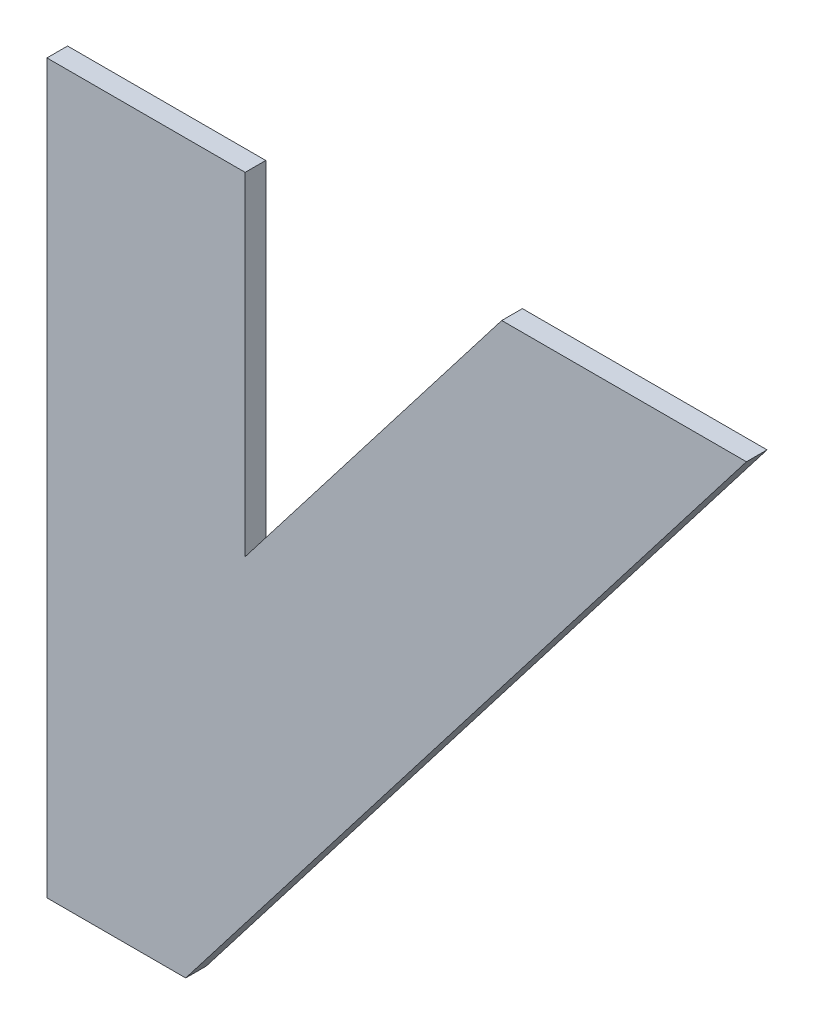
ISO-10303-21;
HEADER;
FILE_DESCRIPTION(('STEP AP214'),'2;1');
FILE_NAME('part.step','',(''),(''),'','','');
FILE_SCHEMA(('AUTOMOTIVE_DESIGN { 1 0 10303 214 1 1 1 1 }'));
ENDSEC;
DATA;
#1=APPLICATION_CONTEXT('core data for automotive mechanical design processes');
#2=APPLICATION_PROTOCOL_DEFINITION('international standard','automotive_design',2000,#1);
#3=PRODUCT_CONTEXT('',#1,'mechanical');
#4=PRODUCT('Part','Part','',(#3));
#5=PRODUCT_RELATED_PRODUCT_CATEGORY('part','',(#4));
#6=PRODUCT_DEFINITION_FORMATION('','',#4);
#7=PRODUCT_DEFINITION_CONTEXT('part definition',#1,'design');
#8=PRODUCT_DEFINITION('design','',#6,#7);
#9=PRODUCT_DEFINITION_SHAPE('','',#8);
#10=(LENGTH_UNIT() NAMED_UNIT(*) SI_UNIT(.MILLI.,.METRE.));
#11=(NAMED_UNIT(*) PLANE_ANGLE_UNIT() SI_UNIT($,.RADIAN.));
#12=(NAMED_UNIT(*) SI_UNIT($,.STERADIAN.) SOLID_ANGLE_UNIT());
#13=UNCERTAINTY_MEASURE_WITH_UNIT(LENGTH_MEASURE(1.E-05),#10,'distance_accuracy_value','');
#14=(GEOMETRIC_REPRESENTATION_CONTEXT(3) GLOBAL_UNCERTAINTY_ASSIGNED_CONTEXT((#13)) GLOBAL_UNIT_ASSIGNED_CONTEXT((#10,
#11,#12)) REPRESENTATION_CONTEXT('',''));
#15=CARTESIAN_POINT('',(0.,0.,0.));
#16=DIRECTION('',(0.,0.,1.));
#17=DIRECTION('',(1.,0.,0.));
#18=AXIS2_PLACEMENT_3D('',#15,#16,#17);
#19=CARTESIAN_POINT('',(-3.07692307692411,-14.6153846153846,0.6));
#20=DIRECTION('',(0.,1.,0.));
#21=DIRECTION('',(0.,0.,1.));
#22=AXIS2_PLACEMENT_3D('',#19,#20,#21);
#23=PLANE('',#22);
#24=DIRECTION('',(-1.,0.,0.));
#25=VECTOR('',#24,1.);
#26=CARTESIAN_POINT('',(-3.07692307692411,-14.6153846153846,1.));
#27=LINE('',#26,#25);
#28=CARTESIAN_POINT('',(-3.07692307692411,-14.6153846153846,1.));
#29=VERTEX_POINT('',#28);
#30=CARTESIAN_POINT('',(-5.7692307692318,-14.6153846153846,1.));
#31=VERTEX_POINT('',#30);
#32=EDGE_CURVE('E119',#29,#31,#27,.T.);
#33=ORIENTED_EDGE('',*,*,#32,.T.);
#34=DIRECTION('',(0.,0.,1.));
#35=VECTOR('',#34,1.);
#36=CARTESIAN_POINT('',(-5.7692307692318,-14.6153846153846,0.6));
#37=LINE('',#36,#35);
#38=CARTESIAN_POINT('',(-5.7692307692318,-14.6153846153846,0.6));
#39=VERTEX_POINT('',#38);
#40=EDGE_CURVE('E131',#39,#31,#37,.T.);
#41=ORIENTED_EDGE('',*,*,#40,.F.);
#42=DIRECTION('',(-1.,0.,0.));
#43=VECTOR('',#42,1.);
#44=CARTESIAN_POINT('',(-3.07692307692411,-14.6153846153846,0.6));
#45=LINE('',#44,#43);
#46=CARTESIAN_POINT('',(-3.07692307692411,-14.6153846153846,0.6));
#47=VERTEX_POINT('',#46);
#48=EDGE_CURVE('E136',#47,#39,#45,.T.);
#49=ORIENTED_EDGE('',*,*,#48,.F.);
#50=DIRECTION('',(0.,0.,1.));
#51=VECTOR('',#50,1.);
#52=CARTESIAN_POINT('',(-3.07692307692411,-14.6153846153846,0.6));
#53=LINE('',#52,#51);
#54=EDGE_CURVE('E50',#47,#29,#53,.T.);
#55=ORIENTED_EDGE('',*,*,#54,.T.);
#56=EDGE_LOOP('',(#33,#41,#49,#55));
#57=FACE_BOUND('',#56,.T.);
#58=ADVANCED_FACE('F39',(#57),#23,.F.);
#59=CARTESIAN_POINT('',(-1.92307692307796,3.84615384615385,0.6));
#60=DIRECTION('',(-1.,0.,0.));
#61=DIRECTION('',(0.,0.,1.));
#62=AXIS2_PLACEMENT_3D('',#59,#60,#61);
#63=PLANE('',#62);
#64=DIRECTION('',(0.,-1.,0.));
#65=VECTOR('',#64,1.);
#66=CARTESIAN_POINT('',(-1.92307692307796,3.84615384615385,0.6));
#67=LINE('',#66,#65);
#68=CARTESIAN_POINT('',(-1.92307692307796,-0.5,0.6));
#69=VERTEX_POINT('',#68);
#70=CARTESIAN_POINT('',(-1.92307692307796,-6.95913461538461,0.6));
#71=VERTEX_POINT('',#70);
#72=EDGE_CURVE('E143',#69,#71,#67,.T.);
#73=ORIENTED_EDGE('',*,*,#72,.F.);
#74=DIRECTION('',(0.,0.,1.));
#75=VECTOR('',#74,1.);
#76=CARTESIAN_POINT('',(-1.92307692307796,-0.5,0.6));
#77=LINE('',#76,#75);
#78=CARTESIAN_POINT('',(-1.92307692307796,-0.5,1.));
#79=VERTEX_POINT('',#78);
#80=EDGE_CURVE('E11',#69,#79,#77,.T.);
#81=ORIENTED_EDGE('',*,*,#80,.T.);
#82=DIRECTION('',(0.,-1.,0.));
#83=VECTOR('',#82,1.);
#84=CARTESIAN_POINT('',(-1.92307692307796,3.84615384615385,1.));
#85=LINE('',#84,#83);
#86=CARTESIAN_POINT('',(-1.92307692307796,-6.95913461538461,1.));
#87=VERTEX_POINT('',#86);
#88=EDGE_CURVE('E115',#79,#87,#85,.T.);
#89=ORIENTED_EDGE('',*,*,#88,.T.);
#90=DIRECTION('',(0.,0.,1.));
#91=VECTOR('',#90,1.);
#92=CARTESIAN_POINT('',(-1.92307692307796,-6.95913461538461,0.6));
#93=LINE('',#92,#91);
#94=EDGE_CURVE('E120',#71,#87,#93,.T.);
#95=ORIENTED_EDGE('',*,*,#94,.F.);
#96=EDGE_LOOP('',(#73,#81,#89,#95));
#97=FACE_BOUND('',#96,.T.);
#98=ADVANCED_FACE('F164',(#97),#63,.F.);
#99=CARTESIAN_POINT('',(-1.92307692307796,-6.95913461538461,0.6));
#100=DIRECTION('',(0.79200132254956,-0.610519373222297,0.));
#101=DIRECTION('',(0.610519373222298,0.792001322549561,0.));
#102=AXIS2_PLACEMENT_3D('',#99,#100,#101);
#103=PLANE('',#102);
#104=DIRECTION('',(0.610519373222298,0.792001322549561,0.));
#105=VECTOR('',#104,1.);
#106=CARTESIAN_POINT('',(-1.92307692307796,-6.95913461538461,1.));
#107=LINE('',#106,#105);
#108=CARTESIAN_POINT('',(3.05598902626747,-0.5,1.));
#109=VERTEX_POINT('',#108);
#110=EDGE_CURVE('E145',#87,#109,#107,.T.);
#111=ORIENTED_EDGE('',*,*,#110,.T.);
#112=DIRECTION('',(0.,0.,-1.));
#113=VECTOR('',#112,1.);
#114=CARTESIAN_POINT('',(3.05598902626747,-0.5,0.6));
#115=LINE('',#114,#113);
#116=CARTESIAN_POINT('',(3.05598902626747,-0.499999999999999,0.6));
#117=VERTEX_POINT('',#116);
#118=EDGE_CURVE('E98',#109,#117,#115,.T.);
#119=ORIENTED_EDGE('',*,*,#118,.T.);
#120=DIRECTION('',(0.610519373222298,0.792001322549561,0.));
#121=VECTOR('',#120,1.);
#122=CARTESIAN_POINT('',(-1.92307692307796,-6.95913461538461,0.6));
#123=LINE('',#122,#121);
#124=EDGE_CURVE('E121',#71,#117,#123,.T.);
#125=ORIENTED_EDGE('',*,*,#124,.F.);
#126=ORIENTED_EDGE('',*,*,#94,.T.);
#127=EDGE_LOOP('',(#111,#119,#125,#126));
#128=FACE_BOUND('',#127,.T.);
#129=ADVANCED_FACE('F161',(#128),#103,.F.);
#130=CARTESIAN_POINT('',(0.,0.,0.6));
#131=DIRECTION('',(0.,0.,-1.));
#132=DIRECTION('',(-1.,0.,0.));
#133=AXIS2_PLACEMENT_3D('',#130,#131,#132);
#134=PLANE('',#133);
#135=DIRECTION('',(-1.,0.,0.));
#136=VECTOR('',#135,1.);
#137=CARTESIAN_POINT('',(0.,-0.5,0.6));
#138=LINE('',#137,#136);
#139=CARTESIAN_POINT('',(7.80368589743486,-0.5,0.6));
#140=VERTEX_POINT('',#139);
#141=EDGE_CURVE('E53',#140,#117,#138,.T.);
#142=ORIENTED_EDGE('',*,*,#141,.F.);
#143=DIRECTION('',(-0.610507860339303,-0.792010197196934,0.));
#144=VECTOR('',#143,1.);
#145=CARTESIAN_POINT('',(11.1538461538451,3.84615384615385,0.6));
#146=LINE('',#145,#144);
#147=EDGE_CURVE('E112',#140,#47,#146,.T.);
#148=ORIENTED_EDGE('',*,*,#147,.T.);
#149=ORIENTED_EDGE('',*,*,#48,.T.);
#150=DIRECTION('',(0.,1.,0.));
#151=VECTOR('',#150,1.);
#152=CARTESIAN_POINT('',(-5.7692307692318,-14.6153846153846,0.6));
#153=LINE('',#152,#151);
#154=CARTESIAN_POINT('',(-5.7692307692318,-0.5,0.6));
#155=VERTEX_POINT('',#154);
#156=EDGE_CURVE('E128',#39,#155,#153,.T.);
#157=ORIENTED_EDGE('',*,*,#156,.T.);
#158=EDGE_CURVE('E101',#69,#155,#138,.T.);
#159=ORIENTED_EDGE('',*,*,#158,.F.);
#160=ORIENTED_EDGE('',*,*,#72,.T.);
#161=ORIENTED_EDGE('',*,*,#124,.T.);
#162=EDGE_LOOP('',(#142,#148,#149,#157,#159,#160,#161));
#163=FACE_BOUND('',#162,.T.);
#164=ADVANCED_FACE('F160',(#163),#134,.T.);
#165=CARTESIAN_POINT('',(-5.7692307692318,-14.6153846153846,0.6));
#166=DIRECTION('',(1.,0.,0.));
#167=DIRECTION('',(0.,0.,-1.));
#168=AXIS2_PLACEMENT_3D('',#165,#166,#167);
#169=PLANE('',#168);
#170=DIRECTION('',(0.,1.,0.));
#171=VECTOR('',#170,1.);
#172=CARTESIAN_POINT('',(-5.7692307692318,-14.6153846153846,1.));
#173=LINE('',#172,#171);
#174=CARTESIAN_POINT('',(-5.7692307692318,-0.5,1.));
#175=VERTEX_POINT('',#174);
#176=EDGE_CURVE('E118',#31,#175,#173,.T.);
#177=ORIENTED_EDGE('',*,*,#176,.T.);
#178=DIRECTION('',(0.,0.,-1.));
#179=VECTOR('',#178,1.);
#180=CARTESIAN_POINT('',(-5.7692307692318,-0.5,0.6));
#181=LINE('',#180,#179);
#182=EDGE_CURVE('E148',#175,#155,#181,.T.);
#183=ORIENTED_EDGE('',*,*,#182,.T.);
#184=ORIENTED_EDGE('',*,*,#156,.F.);
#185=ORIENTED_EDGE('',*,*,#40,.T.);
#186=EDGE_LOOP('',(#177,#183,#184,#185));
#187=FACE_BOUND('',#186,.T.);
#188=ADVANCED_FACE('F153',(#187),#169,.F.);
#189=CARTESIAN_POINT('',(11.1538461538451,3.84615384615385,0.6));
#190=DIRECTION('',(-0.792010197196934,0.610507860339303,0.));
#191=DIRECTION('',(-0.610507860339303,-0.792010197196934,0.));
#192=AXIS2_PLACEMENT_3D('',#189,#190,#191);
#193=PLANE('',#192);
#194=ORIENTED_EDGE('',*,*,#147,.F.);
#195=DIRECTION('',(0.,0.,1.));
#196=VECTOR('',#195,1.);
#197=CARTESIAN_POINT('',(7.80368589743486,-0.5,0.6));
#198=LINE('',#197,#196);
#199=CARTESIAN_POINT('',(7.80368589743486,-0.5,1.));
#200=VERTEX_POINT('',#199);
#201=EDGE_CURVE('E97',#140,#200,#198,.T.);
#202=ORIENTED_EDGE('',*,*,#201,.T.);
#203=DIRECTION('',(-0.610507860339303,-0.792010197196934,0.));
#204=VECTOR('',#203,1.);
#205=CARTESIAN_POINT('',(11.1538461538451,3.84615384615385,1.));
#206=LINE('',#205,#204);
#207=EDGE_CURVE('E106',#200,#29,#206,.T.);
#208=ORIENTED_EDGE('',*,*,#207,.T.);
#209=ORIENTED_EDGE('',*,*,#54,.F.);
#210=EDGE_LOOP('',(#194,#202,#208,#209));
#211=FACE_BOUND('',#210,.T.);
#212=ADVANCED_FACE('F41',(#211),#193,.F.);
#213=CARTESIAN_POINT('',(0.,0.,1.));
#214=DIRECTION('',(0.,0.,-1.));
#215=DIRECTION('',(-1.,0.,0.));
#216=AXIS2_PLACEMENT_3D('',#213,#214,#215);
#217=PLANE('',#216);
#218=ORIENTED_EDGE('',*,*,#207,.F.);
#219=DIRECTION('',(-1.,0.,0.));
#220=VECTOR('',#219,1.);
#221=CARTESIAN_POINT('',(-17.,-0.5,1.));
#222=LINE('',#221,#220);
#223=EDGE_CURVE('E94',#200,#109,#222,.T.);
#224=ORIENTED_EDGE('',*,*,#223,.T.);
#225=ORIENTED_EDGE('',*,*,#110,.F.);
#226=ORIENTED_EDGE('',*,*,#88,.F.);
#227=EDGE_CURVE('E64',#79,#175,#222,.T.);
#228=ORIENTED_EDGE('',*,*,#227,.T.);
#229=ORIENTED_EDGE('',*,*,#176,.F.);
#230=ORIENTED_EDGE('',*,*,#32,.F.);
#231=EDGE_LOOP('',(#218,#224,#225,#226,#228,#229,#230));
#232=FACE_BOUND('',#231,.T.);
#233=ADVANCED_FACE('F113',(#232),#217,.F.);
#234=CARTESIAN_POINT('',(-17.,-0.5,1.));
#235=DIRECTION('',(0.,-1.,0.));
#236=DIRECTION('',(0.,0.,-1.));
#237=AXIS2_PLACEMENT_3D('',#234,#235,#236);
#238=PLANE('',#237);
#239=ORIENTED_EDGE('',*,*,#227,.F.);
#240=ORIENTED_EDGE('',*,*,#80,.F.);
#241=ORIENTED_EDGE('',*,*,#158,.T.);
#242=ORIENTED_EDGE('',*,*,#182,.F.);
#243=EDGE_LOOP('',(#239,#240,#241,#242));
#244=FACE_BOUND('',#243,.T.);
#245=ADVANCED_FACE('F182',(#244),#238,.F.);
#246=ORIENTED_EDGE('',*,*,#141,.T.);
#247=ORIENTED_EDGE('',*,*,#118,.F.);
#248=ORIENTED_EDGE('',*,*,#223,.F.);
#249=ORIENTED_EDGE('',*,*,#201,.F.);
#250=EDGE_LOOP('',(#246,#247,#248,#249));
#251=FACE_BOUND('',#250,.T.);
#252=ADVANCED_FACE('F100',(#251),#238,.F.);
#253=CLOSED_SHELL('',(#58,#98,#129,#164,#188,#212,#233,#245,#252));
#254=MANIFOLD_SOLID_BREP('B2',#253);
#255=ADVANCED_BREP_SHAPE_REPRESENTATION('',(#18,#254),#14);
#256=SHAPE_DEFINITION_REPRESENTATION(#9,#255);
ENDSEC;
END-ISO-10303-21;
